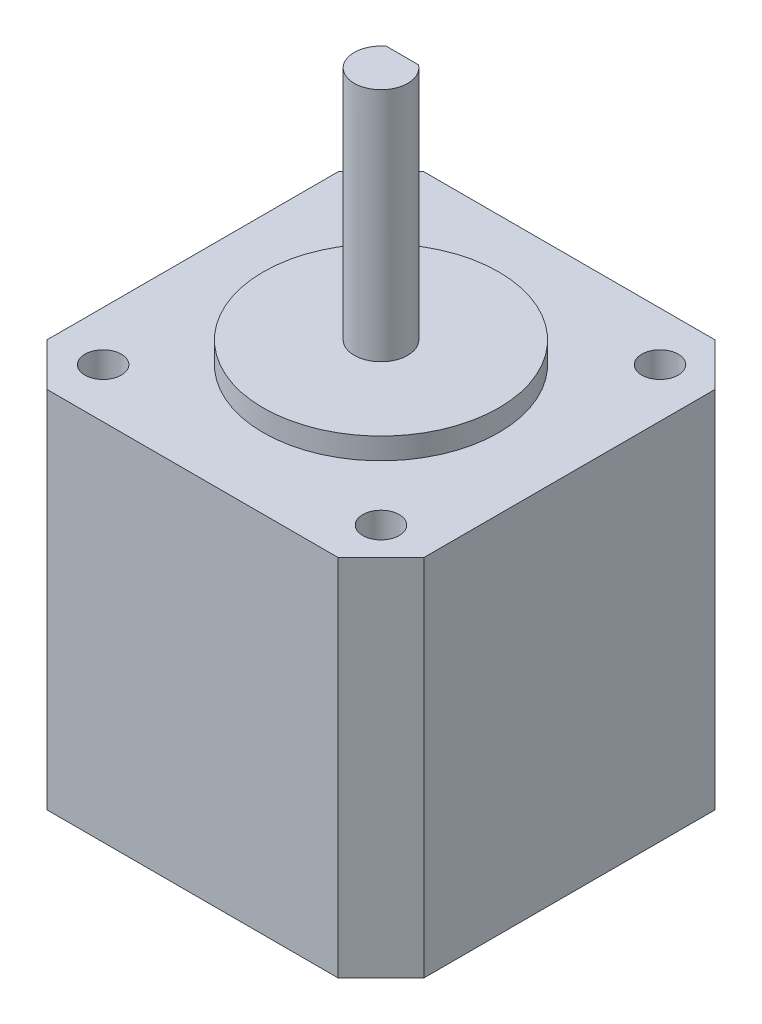
ISO-10303-21;
HEADER;
FILE_DESCRIPTION(('STEP AP214'),'2;1');
FILE_NAME('part.step','',(''),(''),'','','');
FILE_SCHEMA(('AUTOMOTIVE_DESIGN { 1 0 10303 214 1 1 1 1 }'));
ENDSEC;
DATA;
#1=APPLICATION_CONTEXT('core data for automotive mechanical design processes');
#2=APPLICATION_PROTOCOL_DEFINITION('international standard','automotive_design',2000,#1);
#3=PRODUCT_CONTEXT('',#1,'mechanical');
#4=PRODUCT('Part','Part','',(#3));
#5=PRODUCT_RELATED_PRODUCT_CATEGORY('part','',(#4));
#6=PRODUCT_DEFINITION_FORMATION('','',#4);
#7=PRODUCT_DEFINITION_CONTEXT('part definition',#1,'design');
#8=PRODUCT_DEFINITION('design','',#6,#7);
#9=PRODUCT_DEFINITION_SHAPE('','',#8);
#10=(LENGTH_UNIT() NAMED_UNIT(*) SI_UNIT(.MILLI.,.METRE.));
#11=(NAMED_UNIT(*) PLANE_ANGLE_UNIT() SI_UNIT($,.RADIAN.));
#12=(NAMED_UNIT(*) SI_UNIT($,.STERADIAN.) SOLID_ANGLE_UNIT());
#13=UNCERTAINTY_MEASURE_WITH_UNIT(LENGTH_MEASURE(1.E-05),#10,'distance_accuracy_value','');
#14=(GEOMETRIC_REPRESENTATION_CONTEXT(3) GLOBAL_UNCERTAINTY_ASSIGNED_CONTEXT((#13)) GLOBAL_UNIT_ASSIGNED_CONTEXT((#10,
#11,#12)) REPRESENTATION_CONTEXT('',''));
#15=CARTESIAN_POINT('',(0.,0.,0.));
#16=DIRECTION('',(0.,0.,1.));
#17=DIRECTION('',(1.,0.,0.));
#18=AXIS2_PLACEMENT_3D('',#15,#16,#17);
#19=CARTESIAN_POINT('',(11.6994704121575,34.,-11.6994704121575));
#20=DIRECTION('',(0.707106781186547,0.,-0.707106781186548));
#21=DIRECTION('',(-0.707106781186548,0.,-0.707106781186547));
#22=AXIS2_PLACEMENT_3D('',#19,#20,#21);
#23=PLANE('',#22);
#24=DIRECTION('',(0.707106781186548,0.,0.707106781186547));
#25=VECTOR('',#24,1.);
#26=CARTESIAN_POINT('',(11.6994704121575,0.,-11.6994704121575));
#27=LINE('',#26,#25);
#28=CARTESIAN_POINT('',(11.8280751176163,0.,-11.5708657066987));
#29=VERTEX_POINT('',#28);
#30=CARTESIAN_POINT('',(15.8280751176163,0.,-7.57086570669866));
#31=VERTEX_POINT('',#30);
#32=EDGE_CURVE('E153',#29,#31,#27,.T.);
#33=ORIENTED_EDGE('',*,*,#32,.F.);
#34=DIRECTION('',(0.,-1.,0.));
#35=VECTOR('',#34,1.);
#36=CARTESIAN_POINT('',(11.8280751176163,34.,-11.5708657066987));
#37=LINE('',#36,#35);
#38=CARTESIAN_POINT('',(11.8280751176163,34.,-11.5708657066987));
#39=VERTEX_POINT('',#38);
#40=EDGE_CURVE('E36',#39,#29,#37,.T.);
#41=ORIENTED_EDGE('',*,*,#40,.F.);
#42=DIRECTION('',(0.707106781186548,0.,0.707106781186547));
#43=VECTOR('',#42,1.);
#44=CARTESIAN_POINT('',(11.6994704121575,34.,-11.6994704121575));
#45=LINE('',#44,#43);
#46=CARTESIAN_POINT('',(15.8280751176163,34.,-7.57086570669866));
#47=VERTEX_POINT('',#46);
#48=EDGE_CURVE('E183',#39,#47,#45,.T.);
#49=ORIENTED_EDGE('',*,*,#48,.T.);
#50=DIRECTION('',(0.,-1.,0.));
#51=VECTOR('',#50,1.);
#52=CARTESIAN_POINT('',(15.8280751176163,34.,-7.57086570669866));
#53=LINE('',#52,#51);
#54=EDGE_CURVE('E56',#47,#31,#53,.T.);
#55=ORIENTED_EDGE('',*,*,#54,.T.);
#56=EDGE_LOOP('',(#33,#41,#49,#55));
#57=FACE_BOUND('',#56,.T.);
#58=ADVANCED_FACE('F33',(#57),#23,.T.);
#59=CARTESIAN_POINT('',(0.,34.,-11.5708657066987));
#60=DIRECTION('',(0.,0.,-1.));
#61=DIRECTION('',(-1.,0.,0.));
#62=AXIS2_PLACEMENT_3D('',#59,#60,#61);
#63=PLANE('',#62);
#64=DIRECTION('',(1.,0.,0.));
#65=VECTOR('',#64,1.);
#66=CARTESIAN_POINT('',(0.,0.,-11.5708657066987));
#67=LINE('',#66,#65);
#68=CARTESIAN_POINT('',(-15.3719248823837,0.,-11.5708657066987));
#69=VERTEX_POINT('',#68);
#70=EDGE_CURVE('E155',#69,#29,#67,.T.);
#71=ORIENTED_EDGE('',*,*,#70,.F.);
#72=DIRECTION('',(0.,-1.,0.));
#73=VECTOR('',#72,1.);
#74=CARTESIAN_POINT('',(-15.3719248823837,34.,-11.5708657066987));
#75=LINE('',#74,#73);
#76=CARTESIAN_POINT('',(-15.3719248823837,34.,-11.5708657066987));
#77=VERTEX_POINT('',#76);
#78=EDGE_CURVE('E192',#77,#69,#75,.T.);
#79=ORIENTED_EDGE('',*,*,#78,.F.);
#80=DIRECTION('',(1.,0.,0.));
#81=VECTOR('',#80,1.);
#82=CARTESIAN_POINT('',(0.,34.,-11.5708657066987));
#83=LINE('',#82,#81);
#84=EDGE_CURVE('E201',#77,#39,#83,.T.);
#85=ORIENTED_EDGE('',*,*,#84,.T.);
#86=ORIENTED_EDGE('',*,*,#40,.T.);
#87=EDGE_LOOP('',(#71,#79,#85,#86));
#88=FACE_BOUND('',#87,.T.);
#89=ADVANCED_FACE('F199',(#88),#63,.T.);
#90=CARTESIAN_POINT('',(-13.4713952945412,34.,-13.4713952945412));
#91=DIRECTION('',(0.707106781186548,0.,0.707106781186547));
#92=DIRECTION('',(0.707106781186547,0.,-0.707106781186548));
#93=AXIS2_PLACEMENT_3D('',#90,#91,#92);
#94=PLANE('',#93);
#95=DIRECTION('',(-0.707106781186547,0.,0.707106781186548));
#96=VECTOR('',#95,1.);
#97=CARTESIAN_POINT('',(-13.4713952945412,0.,-13.4713952945412));
#98=LINE('',#97,#96);
#99=CARTESIAN_POINT('',(-19.3719248823837,0.,-7.57086570669866));
#100=VERTEX_POINT('',#99);
#101=EDGE_CURVE('E159',#69,#100,#98,.T.);
#102=ORIENTED_EDGE('',*,*,#101,.T.);
#103=DIRECTION('',(0.,-1.,0.));
#104=VECTOR('',#103,1.);
#105=CARTESIAN_POINT('',(-19.3719248823837,34.,-7.57086570669866));
#106=LINE('',#105,#104);
#107=CARTESIAN_POINT('',(-19.3719248823837,34.,-7.57086570669866));
#108=VERTEX_POINT('',#107);
#109=EDGE_CURVE('E190',#108,#100,#106,.T.);
#110=ORIENTED_EDGE('',*,*,#109,.F.);
#111=DIRECTION('',(-0.707106781186547,0.,0.707106781186548));
#112=VECTOR('',#111,1.);
#113=CARTESIAN_POINT('',(-13.4713952945412,34.,-13.4713952945412));
#114=LINE('',#113,#112);
#115=EDGE_CURVE('E214',#77,#108,#114,.T.);
#116=ORIENTED_EDGE('',*,*,#115,.F.);
#117=ORIENTED_EDGE('',*,*,#78,.T.);
#118=EDGE_LOOP('',(#102,#110,#116,#117));
#119=FACE_BOUND('',#118,.T.);
#120=ADVANCED_FACE('F208',(#119),#94,.F.);
#121=CARTESIAN_POINT('',(-19.3719248823837,34.,0.));
#122=DIRECTION('',(1.,0.,0.));
#123=DIRECTION('',(0.,0.,-1.));
#124=AXIS2_PLACEMENT_3D('',#121,#122,#123);
#125=PLANE('',#124);
#126=DIRECTION('',(0.,0.,1.));
#127=VECTOR('',#126,1.);
#128=CARTESIAN_POINT('',(-19.3719248823837,0.,0.));
#129=LINE('',#128,#127);
#130=CARTESIAN_POINT('',(-19.3719248823837,0.,19.6291342933013));
#131=VERTEX_POINT('',#130);
#132=EDGE_CURVE('E161',#100,#131,#129,.T.);
#133=ORIENTED_EDGE('',*,*,#132,.T.);
#134=DIRECTION('',(0.,-1.,0.));
#135=VECTOR('',#134,1.);
#136=CARTESIAN_POINT('',(-19.3719248823837,34.,19.6291342933013));
#137=LINE('',#136,#135);
#138=CARTESIAN_POINT('',(-19.3719248823837,34.,19.6291342933013));
#139=VERTEX_POINT('',#138);
#140=EDGE_CURVE('E187',#139,#131,#137,.T.);
#141=ORIENTED_EDGE('',*,*,#140,.F.);
#142=DIRECTION('',(0.,0.,1.));
#143=VECTOR('',#142,1.);
#144=CARTESIAN_POINT('',(-19.3719248823837,34.,0.));
#145=LINE('',#144,#143);
#146=EDGE_CURVE('E213',#108,#139,#145,.T.);
#147=ORIENTED_EDGE('',*,*,#146,.F.);
#148=ORIENTED_EDGE('',*,*,#109,.T.);
#149=EDGE_LOOP('',(#133,#141,#147,#148));
#150=FACE_BOUND('',#149,.T.);
#151=ADVANCED_FACE('F211',(#150),#125,.F.);
#152=CARTESIAN_POINT('',(-19.5005295878425,34.,19.5005295878425));
#153=DIRECTION('',(0.707106781186548,0.,-0.707106781186547));
#154=DIRECTION('',(-0.707106781186547,0.,-0.707106781186548));
#155=AXIS2_PLACEMENT_3D('',#152,#153,#154);
#156=PLANE('',#155);
#157=DIRECTION('',(0.707106781186547,0.,0.707106781186548));
#158=VECTOR('',#157,1.);
#159=CARTESIAN_POINT('',(-19.5005295878425,0.,19.5005295878425));
#160=LINE('',#159,#158);
#161=CARTESIAN_POINT('',(-15.3719248823837,0.,23.6291342933013));
#162=VERTEX_POINT('',#161);
#163=EDGE_CURVE('E163',#131,#162,#160,.T.);
#164=ORIENTED_EDGE('',*,*,#163,.T.);
#165=DIRECTION('',(0.,-1.,0.));
#166=VECTOR('',#165,1.);
#167=CARTESIAN_POINT('',(-15.3719248823837,34.,23.6291342933013));
#168=LINE('',#167,#166);
#169=CARTESIAN_POINT('',(-15.3719248823837,34.,23.6291342933013));
#170=VERTEX_POINT('',#169);
#171=EDGE_CURVE('E132',#170,#162,#168,.T.);
#172=ORIENTED_EDGE('',*,*,#171,.F.);
#173=DIRECTION('',(0.707106781186547,0.,0.707106781186548));
#174=VECTOR('',#173,1.);
#175=CARTESIAN_POINT('',(-19.5005295878425,34.,19.5005295878425));
#176=LINE('',#175,#174);
#177=EDGE_CURVE('E119',#139,#170,#176,.T.);
#178=ORIENTED_EDGE('',*,*,#177,.F.);
#179=ORIENTED_EDGE('',*,*,#140,.T.);
#180=EDGE_LOOP('',(#164,#172,#178,#179));
#181=FACE_BOUND('',#180,.T.);
#182=ADVANCED_FACE('F275',(#181),#156,.F.);
#183=CARTESIAN_POINT('',(0.,34.,23.6291342933013));
#184=DIRECTION('',(0.,0.,-1.));
#185=DIRECTION('',(-1.,0.,0.));
#186=AXIS2_PLACEMENT_3D('',#183,#184,#185);
#187=PLANE('',#186);
#188=DIRECTION('',(1.,0.,0.));
#189=VECTOR('',#188,1.);
#190=CARTESIAN_POINT('',(0.,0.,23.6291342933013));
#191=LINE('',#190,#189);
#192=CARTESIAN_POINT('',(11.8280751176163,0.,23.6291342933013));
#193=VERTEX_POINT('',#192);
#194=EDGE_CURVE('E128',#162,#193,#191,.T.);
#195=ORIENTED_EDGE('',*,*,#194,.T.);
#196=DIRECTION('',(0.,-1.,0.));
#197=VECTOR('',#196,1.);
#198=CARTESIAN_POINT('',(11.8280751176163,34.,23.6291342933013));
#199=LINE('',#198,#197);
#200=CARTESIAN_POINT('',(11.8280751176163,34.,23.6291342933013));
#201=VERTEX_POINT('',#200);
#202=EDGE_CURVE('E125',#201,#193,#199,.T.);
#203=ORIENTED_EDGE('',*,*,#202,.F.);
#204=DIRECTION('',(1.,0.,0.));
#205=VECTOR('',#204,1.);
#206=CARTESIAN_POINT('',(0.,34.,23.6291342933013));
#207=LINE('',#206,#205);
#208=EDGE_CURVE('E111',#170,#201,#207,.T.);
#209=ORIENTED_EDGE('',*,*,#208,.F.);
#210=ORIENTED_EDGE('',*,*,#171,.T.);
#211=EDGE_LOOP('',(#195,#203,#209,#210));
#212=FACE_BOUND('',#211,.T.);
#213=ADVANCED_FACE('F126',(#212),#187,.F.);
#214=CARTESIAN_POINT('',(17.7286047054588,34.,17.7286047054588));
#215=DIRECTION('',(0.707106781186548,0.,0.707106781186547));
#216=DIRECTION('',(0.707106781186547,0.,-0.707106781186548));
#217=AXIS2_PLACEMENT_3D('',#214,#215,#216);
#218=PLANE('',#217);
#219=DIRECTION('',(-0.707106781186547,0.,0.707106781186548));
#220=VECTOR('',#219,1.);
#221=CARTESIAN_POINT('',(17.7286047054588,0.,17.7286047054588));
#222=LINE('',#221,#220);
#223=CARTESIAN_POINT('',(15.8280751176163,0.,19.6291342933013));
#224=VERTEX_POINT('',#223);
#225=EDGE_CURVE('E166',#224,#193,#222,.T.);
#226=ORIENTED_EDGE('',*,*,#225,.F.);
#227=DIRECTION('',(0.,-1.,0.));
#228=VECTOR('',#227,1.);
#229=CARTESIAN_POINT('',(15.8280751176163,34.,19.6291342933013));
#230=LINE('',#229,#228);
#231=CARTESIAN_POINT('',(15.8280751176163,34.,19.6291342933013));
#232=VERTEX_POINT('',#231);
#233=EDGE_CURVE('E133',#232,#224,#230,.T.);
#234=ORIENTED_EDGE('',*,*,#233,.F.);
#235=DIRECTION('',(-0.707106781186547,0.,0.707106781186548));
#236=VECTOR('',#235,1.);
#237=CARTESIAN_POINT('',(17.7286047054588,34.,17.7286047054588));
#238=LINE('',#237,#236);
#239=EDGE_CURVE('E117',#232,#201,#238,.T.);
#240=ORIENTED_EDGE('',*,*,#239,.T.);
#241=ORIENTED_EDGE('',*,*,#202,.T.);
#242=EDGE_LOOP('',(#226,#234,#240,#241));
#243=FACE_BOUND('',#242,.T.);
#244=ADVANCED_FACE('F135',(#243),#218,.T.);
#245=CARTESIAN_POINT('',(-14.7444443269215,34.,-6.94338515123653));
#246=DIRECTION('',(0.,-1.,0.));
#247=DIRECTION('',(0.,0.,-1.));
#248=AXIS2_PLACEMENT_3D('',#245,#246,#247);
#249=CYLINDRICAL_SURFACE('',#248,1.7);
#250=CARTESIAN_POINT('',(-14.7444443269215,34.,-6.94338515123653));
#251=DIRECTION('',(0.,1.,0.));
#252=DIRECTION('',(0.,0.,1.));
#253=AXIS2_PLACEMENT_3D('',#250,#251,#252);
#254=CIRCLE('',#253,1.7);
#255=CARTESIAN_POINT('',(-14.7444443269215,34.,-5.24338515123653));
#256=VERTEX_POINT('',#255);
#257=EDGE_CURVE('E147',#256,#256,#254,.T.);
#258=ORIENTED_EDGE('',*,*,#257,.T.);
#259=EDGE_LOOP('',(#258));
#260=FACE_BOUND('',#259,.T.);
#261=CARTESIAN_POINT('',(-14.7444443269215,0.,-6.94338515123653));
#262=DIRECTION('',(0.,1.,0.));
#263=DIRECTION('',(0.,0.,1.));
#264=AXIS2_PLACEMENT_3D('',#261,#262,#263);
#265=CIRCLE('',#264,1.7);
#266=CARTESIAN_POINT('',(-14.7444443269215,0.,-5.24338515123653));
#267=VERTEX_POINT('',#266);
#268=EDGE_CURVE('E177',#267,#267,#265,.T.);
#269=ORIENTED_EDGE('',*,*,#268,.F.);
#270=EDGE_LOOP('',(#269));
#271=FACE_BOUND('',#270,.T.);
#272=ADVANCED_FACE('F283',(#260,#271),#249,.F.);
#273=CARTESIAN_POINT('',(-14.7445022953526,34.,19.0017117062703));
#274=DIRECTION('',(0.,-1.,0.));
#275=DIRECTION('',(0.,0.,-1.));
#276=AXIS2_PLACEMENT_3D('',#273,#274,#275);
#277=CYLINDRICAL_SURFACE('',#276,1.7);
#278=CARTESIAN_POINT('',(-14.7445022953526,34.,19.0017117062703));
#279=DIRECTION('',(0.,1.,0.));
#280=DIRECTION('',(0.,0.,1.));
#281=AXIS2_PLACEMENT_3D('',#278,#279,#280);
#282=CIRCLE('',#281,1.7);
#283=CARTESIAN_POINT('',(-14.7445022953526,34.,20.7017117062703));
#284=VERTEX_POINT('',#283);
#285=EDGE_CURVE('E144',#284,#284,#282,.T.);
#286=ORIENTED_EDGE('',*,*,#285,.T.);
#287=EDGE_LOOP('',(#286));
#288=FACE_BOUND('',#287,.T.);
#289=CARTESIAN_POINT('',(-14.7445022953526,0.,19.0017117062703));
#290=DIRECTION('',(0.,1.,0.));
#291=DIRECTION('',(0.,0.,1.));
#292=AXIS2_PLACEMENT_3D('',#289,#290,#291);
#293=CIRCLE('',#292,1.7);
#294=CARTESIAN_POINT('',(-14.7445022953526,0.,20.7017117062703));
#295=VERTEX_POINT('',#294);
#296=EDGE_CURVE('E174',#295,#295,#293,.T.);
#297=ORIENTED_EDGE('',*,*,#296,.F.);
#298=EDGE_LOOP('',(#297));
#299=FACE_BOUND('',#298,.T.);
#300=ADVANCED_FACE('F291',(#288,#299),#277,.F.);
#301=CARTESIAN_POINT('',(11.2554977046474,34.,-6.99828829372972));
#302=DIRECTION('',(0.,-1.,0.));
#303=DIRECTION('',(0.,0.,-1.));
#304=AXIS2_PLACEMENT_3D('',#301,#302,#303);
#305=CYLINDRICAL_SURFACE('',#304,1.7);
#306=CARTESIAN_POINT('',(11.2554977046474,34.,-6.99828829372972));
#307=DIRECTION('',(0.,1.,0.));
#308=DIRECTION('',(0.,0.,1.));
#309=AXIS2_PLACEMENT_3D('',#306,#307,#308);
#310=CIRCLE('',#309,1.7);
#311=CARTESIAN_POINT('',(11.2554977046474,34.,-5.29828829372972));
#312=VERTEX_POINT('',#311);
#313=EDGE_CURVE('E138',#312,#312,#310,.T.);
#314=ORIENTED_EDGE('',*,*,#313,.T.);
#315=EDGE_LOOP('',(#314));
#316=FACE_BOUND('',#315,.T.);
#317=CARTESIAN_POINT('',(11.2554977046474,0.,-6.99828829372972));
#318=DIRECTION('',(0.,1.,0.));
#319=DIRECTION('',(0.,0.,1.));
#320=AXIS2_PLACEMENT_3D('',#317,#318,#319);
#321=CIRCLE('',#320,1.7);
#322=CARTESIAN_POINT('',(11.2554977046474,0.,-5.29828829372972));
#323=VERTEX_POINT('',#322);
#324=EDGE_CURVE('E171',#323,#323,#321,.T.);
#325=ORIENTED_EDGE('',*,*,#324,.F.);
#326=EDGE_LOOP('',(#325));
#327=FACE_BOUND('',#326,.T.);
#328=ADVANCED_FACE('F288',(#316,#327),#305,.F.);
#329=CARTESIAN_POINT('',(15.8280751176163,34.,0.));
#330=DIRECTION('',(1.,0.,0.));
#331=DIRECTION('',(0.,0.,-1.));
#332=AXIS2_PLACEMENT_3D('',#329,#330,#331);
#333=PLANE('',#332);
#334=DIRECTION('',(0.,0.,1.));
#335=VECTOR('',#334,1.);
#336=CARTESIAN_POINT('',(15.8280751176163,0.,0.));
#337=LINE('',#336,#335);
#338=EDGE_CURVE('E168',#31,#224,#337,.T.);
#339=ORIENTED_EDGE('',*,*,#338,.F.);
#340=ORIENTED_EDGE('',*,*,#54,.F.);
#341=DIRECTION('',(0.,0.,1.));
#342=VECTOR('',#341,1.);
#343=CARTESIAN_POINT('',(15.8280751176163,34.,0.));
#344=LINE('',#343,#342);
#345=EDGE_CURVE('E136',#47,#232,#344,.T.);
#346=ORIENTED_EDGE('',*,*,#345,.T.);
#347=ORIENTED_EDGE('',*,*,#233,.T.);
#348=EDGE_LOOP('',(#339,#340,#346,#347));
#349=FACE_BOUND('',#348,.T.);
#350=ADVANCED_FACE('F284',(#349),#333,.T.);
#351=CARTESIAN_POINT('',(11.2006525305853,34.,19.0017117062703));
#352=DIRECTION('',(0.,-1.,0.));
#353=DIRECTION('',(0.,0.,-1.));
#354=AXIS2_PLACEMENT_3D('',#351,#352,#353);
#355=CYLINDRICAL_SURFACE('',#354,1.7);
#356=CARTESIAN_POINT('',(11.2006525305853,34.,19.0017117062703));
#357=DIRECTION('',(0.,1.,0.));
#358=DIRECTION('',(0.,0.,1.));
#359=AXIS2_PLACEMENT_3D('',#356,#357,#358);
#360=CIRCLE('',#359,1.7);
#361=CARTESIAN_POINT('',(11.2006525305853,34.,20.7017117062703));
#362=VERTEX_POINT('',#361);
#363=EDGE_CURVE('E150',#362,#362,#360,.T.);
#364=ORIENTED_EDGE('',*,*,#363,.T.);
#365=EDGE_LOOP('',(#364));
#366=FACE_BOUND('',#365,.T.);
#367=CARTESIAN_POINT('',(11.2006525305853,0.,19.0017117062703));
#368=DIRECTION('',(0.,1.,0.));
#369=DIRECTION('',(0.,0.,1.));
#370=AXIS2_PLACEMENT_3D('',#367,#368,#369);
#371=CIRCLE('',#370,1.7);
#372=CARTESIAN_POINT('',(11.2006525305853,0.,20.7017117062703));
#373=VERTEX_POINT('',#372);
#374=EDGE_CURVE('E180',#373,#373,#371,.T.);
#375=ORIENTED_EDGE('',*,*,#374,.F.);
#376=EDGE_LOOP('',(#375));
#377=FACE_BOUND('',#376,.T.);
#378=ADVANCED_FACE('F287',(#366,#377),#355,.F.);
#379=CARTESIAN_POINT('',(0.,34.,0.));
#380=DIRECTION('',(0.,1.,0.));
#381=DIRECTION('',(0.,0.,1.));
#382=AXIS2_PLACEMENT_3D('',#379,#380,#381);
#383=PLANE('',#382);
#384=CARTESIAN_POINT('',(-1.77192488238368,34.,6.02913429330134));
#385=DIRECTION('',(0.,1.,0.));
#386=DIRECTION('',(0.,0.,1.));
#387=AXIS2_PLACEMENT_3D('',#384,#385,#386);
#388=CIRCLE('',#387,11.);
#389=CARTESIAN_POINT('',(-1.77192488238368,34.,17.0291342933013));
#390=VERTEX_POINT('',#389);
#391=EDGE_CURVE('E220',#390,#390,#388,.T.);
#392=ORIENTED_EDGE('',*,*,#391,.F.);
#393=EDGE_LOOP('',(#392));
#394=FACE_BOUND('',#393,.T.);
#395=ORIENTED_EDGE('',*,*,#48,.F.);
#396=ORIENTED_EDGE('',*,*,#84,.F.);
#397=ORIENTED_EDGE('',*,*,#115,.T.);
#398=ORIENTED_EDGE('',*,*,#146,.T.);
#399=ORIENTED_EDGE('',*,*,#177,.T.);
#400=ORIENTED_EDGE('',*,*,#208,.T.);
#401=ORIENTED_EDGE('',*,*,#239,.F.);
#402=ORIENTED_EDGE('',*,*,#345,.F.);
#403=EDGE_LOOP('',(#395,#396,#397,#398,#399,#400,#401,#402));
#404=FACE_BOUND('',#403,.T.);
#405=ORIENTED_EDGE('',*,*,#313,.F.);
#406=EDGE_LOOP('',(#405));
#407=FACE_BOUND('',#406,.T.);
#408=ORIENTED_EDGE('',*,*,#285,.F.);
#409=EDGE_LOOP('',(#408));
#410=FACE_BOUND('',#409,.T.);
#411=ORIENTED_EDGE('',*,*,#257,.F.);
#412=EDGE_LOOP('',(#411));
#413=FACE_BOUND('',#412,.T.);
#414=ORIENTED_EDGE('',*,*,#363,.F.);
#415=EDGE_LOOP('',(#414));
#416=FACE_BOUND('',#415,.T.);
#417=ADVANCED_FACE('F113',(#394,#404,#407,#410,#413,#416),#383,.T.);
#418=CARTESIAN_POINT('',(0.,0.,0.));
#419=DIRECTION('',(0.,1.,0.));
#420=DIRECTION('',(0.,0.,1.));
#421=AXIS2_PLACEMENT_3D('',#418,#419,#420);
#422=PLANE('',#421);
#423=ORIENTED_EDGE('',*,*,#32,.T.);
#424=ORIENTED_EDGE('',*,*,#338,.T.);
#425=ORIENTED_EDGE('',*,*,#225,.T.);
#426=ORIENTED_EDGE('',*,*,#194,.F.);
#427=ORIENTED_EDGE('',*,*,#163,.F.);
#428=ORIENTED_EDGE('',*,*,#132,.F.);
#429=ORIENTED_EDGE('',*,*,#101,.F.);
#430=ORIENTED_EDGE('',*,*,#70,.T.);
#431=EDGE_LOOP('',(#423,#424,#425,#426,#427,#428,#429,#430));
#432=FACE_BOUND('',#431,.T.);
#433=ORIENTED_EDGE('',*,*,#324,.T.);
#434=EDGE_LOOP('',(#433));
#435=FACE_BOUND('',#434,.T.);
#436=ORIENTED_EDGE('',*,*,#296,.T.);
#437=EDGE_LOOP('',(#436));
#438=FACE_BOUND('',#437,.T.);
#439=ORIENTED_EDGE('',*,*,#268,.T.);
#440=EDGE_LOOP('',(#439));
#441=FACE_BOUND('',#440,.T.);
#442=ORIENTED_EDGE('',*,*,#374,.T.);
#443=EDGE_LOOP('',(#442));
#444=FACE_BOUND('',#443,.T.);
#445=ADVANCED_FACE('F203',(#432,#435,#438,#441,#444),#422,.F.);
#446=CARTESIAN_POINT('',(-1.77192488238368,36.,6.02913429330134));
#447=DIRECTION('',(0.,-1.,0.));
#448=DIRECTION('',(0.,0.,-1.));
#449=AXIS2_PLACEMENT_3D('',#446,#447,#448);
#450=CYLINDRICAL_SURFACE('',#449,11.);
#451=CARTESIAN_POINT('',(-1.77192488238368,36.,6.02913429330134));
#452=DIRECTION('',(0.,1.,0.));
#453=DIRECTION('',(0.,0.,1.));
#454=AXIS2_PLACEMENT_3D('',#451,#452,#453);
#455=CIRCLE('',#454,11.);
#456=CARTESIAN_POINT('',(-1.77192488238368,36.,17.0291342933013));
#457=VERTEX_POINT('',#456);
#458=EDGE_CURVE('E156',#457,#457,#455,.T.);
#459=ORIENTED_EDGE('',*,*,#458,.F.);
#460=EDGE_LOOP('',(#459));
#461=FACE_BOUND('',#460,.T.);
#462=ORIENTED_EDGE('',*,*,#391,.T.);
#463=EDGE_LOOP('',(#462));
#464=FACE_BOUND('',#463,.T.);
#465=ADVANCED_FACE('F304',(#461,#464),#450,.T.);
#466=CARTESIAN_POINT('',(-1.77192488238368,36.,6.02913429330134));
#467=DIRECTION('',(0.,1.,0.));
#468=DIRECTION('',(0.,0.,1.));
#469=AXIS2_PLACEMENT_3D('',#466,#467,#468);
#470=PLANE('',#469);
#471=CARTESIAN_POINT('',(-1.77192488238368,36.,6.02913429330134));
#472=DIRECTION('',(0.,1.,0.));
#473=DIRECTION('',(0.,0.,1.));
#474=AXIS2_PLACEMENT_3D('',#471,#472,#473);
#475=CIRCLE('',#474,2.5);
#476=CARTESIAN_POINT('',(-1.77192488238368,36.,8.52913429330134));
#477=VERTEX_POINT('',#476);
#478=EDGE_CURVE('E11',#477,#477,#475,.T.);
#479=ORIENTED_EDGE('',*,*,#478,.F.);
#480=EDGE_LOOP('',(#479));
#481=FACE_BOUND('',#480,.T.);
#482=ORIENTED_EDGE('',*,*,#458,.T.);
#483=EDGE_LOOP('',(#482));
#484=FACE_BOUND('',#483,.T.);
#485=ADVANCED_FACE('F262',(#481,#484),#470,.T.);
#486=CARTESIAN_POINT('',(-1.77192488238368,41.5,6.02913429330134));
#487=DIRECTION('',(0.,-1.,0.));
#488=DIRECTION('',(0.,0.,-1.));
#489=AXIS2_PLACEMENT_3D('',#486,#487,#488);
#490=CYLINDRICAL_SURFACE('',#489,2.5);
#491=CARTESIAN_POINT('',(-1.77192488238368,41.5,6.02913429330134));
#492=DIRECTION('',(0.,1.,0.));
#493=DIRECTION('',(0.,0.,1.));
#494=AXIS2_PLACEMENT_3D('',#491,#492,#493);
#495=CIRCLE('',#494,2.5);
#496=CARTESIAN_POINT('',(-0.271924882383679,41.5,4.02913429330134));
#497=VERTEX_POINT('',#496);
#498=CARTESIAN_POINT('',(-3.27192488238368,41.5,4.02913429330134));
#499=VERTEX_POINT('',#498);
#500=EDGE_CURVE('E223',#497,#499,#495,.T.);
#501=ORIENTED_EDGE('',*,*,#500,.F.);
#502=DIRECTION('',(0.,-1.,0.));
#503=VECTOR('',#502,1.);
#504=CARTESIAN_POINT('',(-0.271924882383678,58.,4.02913429330134));
#505=LINE('',#504,#503);
#506=CARTESIAN_POINT('',(-0.271924882383678,58.,4.02913429330134));
#507=VERTEX_POINT('',#506);
#508=EDGE_CURVE('E227',#507,#497,#505,.T.);
#509=ORIENTED_EDGE('',*,*,#508,.F.);
#510=CARTESIAN_POINT('',(-1.77192488238368,58.,6.02913429330134));
#511=DIRECTION('',(0.,1.,0.));
#512=DIRECTION('',(0.,0.,1.));
#513=AXIS2_PLACEMENT_3D('',#510,#511,#512);
#514=CIRCLE('',#513,2.5);
#515=CARTESIAN_POINT('',(-3.27192488238368,58.,4.02913429330134));
#516=VERTEX_POINT('',#515);
#517=EDGE_CURVE('E235',#516,#507,#514,.T.);
#518=ORIENTED_EDGE('',*,*,#517,.F.);
#519=DIRECTION('',(0.,-1.,0.));
#520=VECTOR('',#519,1.);
#521=CARTESIAN_POINT('',(-3.27192488238368,58.,4.02913429330134));
#522=LINE('',#521,#520);
#523=EDGE_CURVE('E230',#516,#499,#522,.T.);
#524=ORIENTED_EDGE('',*,*,#523,.T.);
#525=EDGE_LOOP('',(#501,#509,#518,#524));
#526=FACE_BOUND('',#525,.T.);
#527=ORIENTED_EDGE('',*,*,#478,.T.);
#528=EDGE_LOOP('',(#527));
#529=FACE_BOUND('',#528,.T.);
#530=ADVANCED_FACE('F248',(#526,#529),#490,.T.);
#531=CARTESIAN_POINT('',(-1.77192488238368,41.5,6.02913429330134));
#532=DIRECTION('',(0.,1.,0.));
#533=DIRECTION('',(0.,0.,1.));
#534=AXIS2_PLACEMENT_3D('',#531,#532,#533);
#535=PLANE('',#534);
#536=DIRECTION('',(-1.,0.,0.));
#537=VECTOR('',#536,1.);
#538=CARTESIAN_POINT('',(-3.27192488238368,41.5,4.02913429330134));
#539=LINE('',#538,#537);
#540=EDGE_CURVE('E47',#497,#499,#539,.T.);
#541=ORIENTED_EDGE('',*,*,#540,.F.);
#542=ORIENTED_EDGE('',*,*,#500,.T.);
#543=EDGE_LOOP('',(#541,#542));
#544=FACE_BOUND('',#543,.T.);
#545=ADVANCED_FACE('F252',(#544),#535,.T.);
#546=CARTESIAN_POINT('',(-3.27192488238368,58.,4.02913429330134));
#547=DIRECTION('',(0.,0.,1.));
#548=DIRECTION('',(1.,0.,0.));
#549=AXIS2_PLACEMENT_3D('',#546,#547,#548);
#550=PLANE('',#549);
#551=ORIENTED_EDGE('',*,*,#540,.T.);
#552=ORIENTED_EDGE('',*,*,#523,.F.);
#553=DIRECTION('',(-1.,0.,0.));
#554=VECTOR('',#553,1.);
#555=CARTESIAN_POINT('',(-3.27192488238368,58.,4.02913429330134));
#556=LINE('',#555,#554);
#557=EDGE_CURVE('E233',#507,#516,#556,.T.);
#558=ORIENTED_EDGE('',*,*,#557,.F.);
#559=ORIENTED_EDGE('',*,*,#508,.T.);
#560=EDGE_LOOP('',(#551,#552,#558,#559));
#561=FACE_BOUND('',#560,.T.);
#562=ADVANCED_FACE('F251',(#561),#550,.F.);
#563=CARTESIAN_POINT('',(-1.77192488238368,58.,6.02913429330134));
#564=DIRECTION('',(0.,1.,0.));
#565=DIRECTION('',(0.,0.,1.));
#566=AXIS2_PLACEMENT_3D('',#563,#564,#565);
#567=PLANE('',#566);
#568=ORIENTED_EDGE('',*,*,#517,.T.);
#569=ORIENTED_EDGE('',*,*,#557,.T.);
#570=EDGE_LOOP('',(#568,#569));
#571=FACE_BOUND('',#570,.T.);
#572=ADVANCED_FACE('F243',(#571),#567,.T.);
#573=CLOSED_SHELL('',(#58,#89,#120,#151,#182,#213,#244,#272,#300,#328,#350,#378,#417,#445,#465,
#485,#530,#545,#562,#572));
#574=MANIFOLD_SOLID_BREP('B2',#573);
#575=ADVANCED_BREP_SHAPE_REPRESENTATION('',(#18,#574),#14);
#576=SHAPE_DEFINITION_REPRESENTATION(#9,#575);
ENDSEC;
END-ISO-10303-21;
